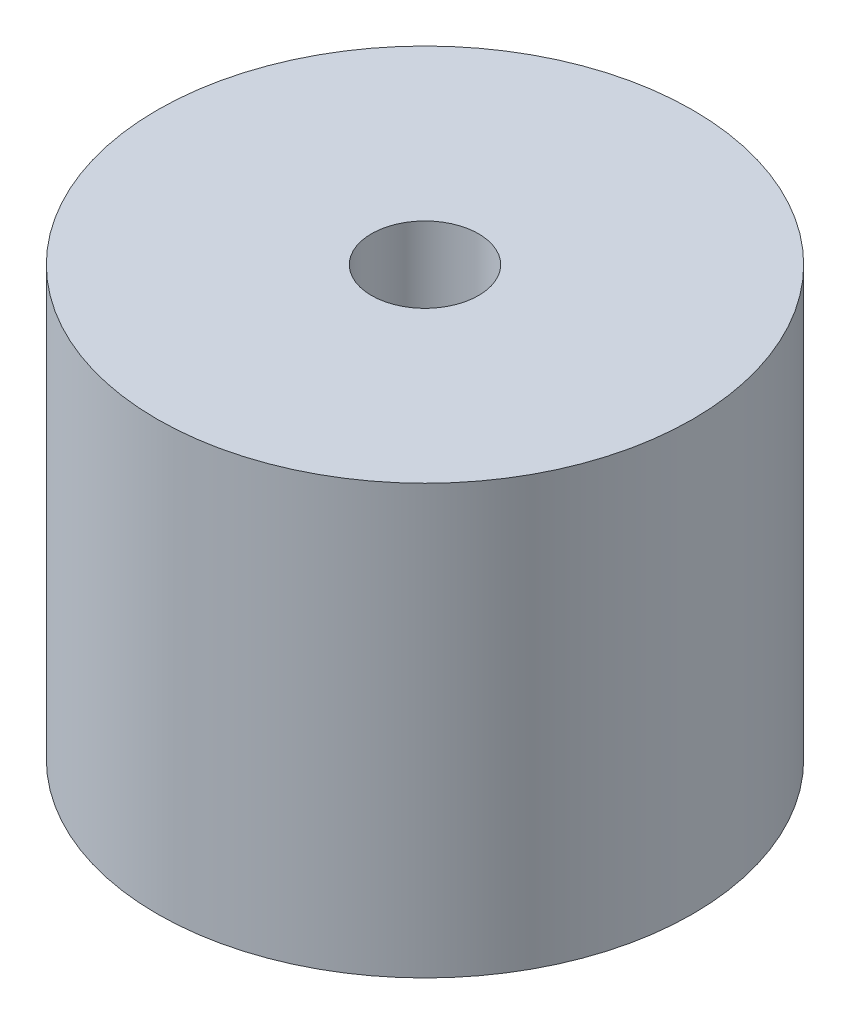
ISO-10303-21;
HEADER;
FILE_DESCRIPTION(('STEP AP214'),'2;1');
FILE_NAME('part.step','',(''),(''),'','','');
FILE_SCHEMA(('AUTOMOTIVE_DESIGN { 1 0 10303 214 1 1 1 1 }'));
ENDSEC;
DATA;
#1=APPLICATION_CONTEXT('core data for automotive mechanical design processes');
#2=APPLICATION_PROTOCOL_DEFINITION('international standard','automotive_design',2000,#1);
#3=PRODUCT_CONTEXT('',#1,'mechanical');
#4=PRODUCT('Part','Part','',(#3));
#5=PRODUCT_RELATED_PRODUCT_CATEGORY('part','',(#4));
#6=PRODUCT_DEFINITION_FORMATION('','',#4);
#7=PRODUCT_DEFINITION_CONTEXT('part definition',#1,'design');
#8=PRODUCT_DEFINITION('design','',#6,#7);
#9=PRODUCT_DEFINITION_SHAPE('','',#8);
#10=(LENGTH_UNIT() NAMED_UNIT(*) SI_UNIT(.MILLI.,.METRE.));
#11=(NAMED_UNIT(*) PLANE_ANGLE_UNIT() SI_UNIT($,.RADIAN.));
#12=(NAMED_UNIT(*) SI_UNIT($,.STERADIAN.) SOLID_ANGLE_UNIT());
#13=UNCERTAINTY_MEASURE_WITH_UNIT(LENGTH_MEASURE(1.E-05),#10,'distance_accuracy_value','');
#14=(GEOMETRIC_REPRESENTATION_CONTEXT(3) GLOBAL_UNCERTAINTY_ASSIGNED_CONTEXT((#13)) GLOBAL_UNIT_ASSIGNED_CONTEXT((#10,
#11,#12)) REPRESENTATION_CONTEXT('',''));
#15=CARTESIAN_POINT('',(0.,0.,0.));
#16=DIRECTION('',(0.,0.,1.));
#17=DIRECTION('',(1.,0.,0.));
#18=AXIS2_PLACEMENT_3D('',#15,#16,#17);
#19=CARTESIAN_POINT('',(-6.31474001961173,20.,-6.44629710335362));
#20=DIRECTION('',(0.,1.,0.));
#21=DIRECTION('',(0.,0.,1.));
#22=AXIS2_PLACEMENT_3D('',#19,#20,#21);
#23=PLANE('',#22);
#24=CARTESIAN_POINT('',(-6.31474001961173,20.,-6.44629710335362));
#25=DIRECTION('',(0.,1.,0.));
#26=DIRECTION('',(0.,0.,1.));
#27=AXIS2_PLACEMENT_3D('',#24,#25,#26);
#28=CIRCLE('',#27,12.5);
#29=CARTESIAN_POINT('',(-6.31474001961173,20.,6.05370289664638));
#30=VERTEX_POINT('',#29);
#31=EDGE_CURVE('E10',#30,#30,#28,.T.);
#32=ORIENTED_EDGE('',*,*,#31,.T.);
#33=EDGE_LOOP('',(#32));
#34=FACE_BOUND('',#33,.T.);
#35=CARTESIAN_POINT('',(-6.31474001961173,20.,-6.44629710335362));
#36=DIRECTION('',(0.,1.,0.));
#37=DIRECTION('',(0.,0.,1.));
#38=AXIS2_PLACEMENT_3D('',#35,#36,#37);
#39=CIRCLE('',#38,2.5);
#40=CARTESIAN_POINT('',(-6.31474001961173,20.,-3.94629710335362));
#41=VERTEX_POINT('',#40);
#42=EDGE_CURVE('E42',#41,#41,#39,.T.);
#43=ORIENTED_EDGE('',*,*,#42,.F.);
#44=EDGE_LOOP('',(#43));
#45=FACE_BOUND('',#44,.T.);
#46=ADVANCED_FACE('F31',(#34,#45),#23,.T.);
#47=CARTESIAN_POINT('',(-6.31474001961173,0.,-6.44629710335362));
#48=DIRECTION('',(0.,1.,0.));
#49=DIRECTION('',(0.,0.,1.));
#50=AXIS2_PLACEMENT_3D('',#47,#48,#49);
#51=PLANE('',#50);
#52=CARTESIAN_POINT('',(-6.31474001961173,0.,-6.44629710335362));
#53=DIRECTION('',(0.,1.,0.));
#54=DIRECTION('',(0.,0.,1.));
#55=AXIS2_PLACEMENT_3D('',#52,#53,#54);
#56=CIRCLE('',#55,12.5);
#57=CARTESIAN_POINT('',(-6.31474001961173,0.,6.05370289664638));
#58=VERTEX_POINT('',#57);
#59=EDGE_CURVE('E35',#58,#58,#56,.T.);
#60=ORIENTED_EDGE('',*,*,#59,.F.);
#61=EDGE_LOOP('',(#60));
#62=FACE_BOUND('',#61,.T.);
#63=CARTESIAN_POINT('',(-6.31474001961173,0.,-6.44629710335362));
#64=DIRECTION('',(0.,1.,0.));
#65=DIRECTION('',(0.,0.,1.));
#66=AXIS2_PLACEMENT_3D('',#63,#64,#65);
#67=CIRCLE('',#66,2.5);
#68=CARTESIAN_POINT('',(-6.31474001961173,0.,-3.94629710335362));
#69=VERTEX_POINT('',#68);
#70=EDGE_CURVE('E44',#69,#69,#67,.T.);
#71=ORIENTED_EDGE('',*,*,#70,.T.);
#72=EDGE_LOOP('',(#71));
#73=FACE_BOUND('',#72,.T.);
#74=ADVANCED_FACE('F54',(#62,#73),#51,.F.);
#75=CARTESIAN_POINT('',(-6.31474001961173,20.,-6.44629710335362));
#76=DIRECTION('',(0.,-1.,0.));
#77=DIRECTION('',(0.,0.,-1.));
#78=AXIS2_PLACEMENT_3D('',#75,#76,#77);
#79=CYLINDRICAL_SURFACE('',#78,12.5);
#80=ORIENTED_EDGE('',*,*,#31,.F.);
#81=EDGE_LOOP('',(#80));
#82=FACE_BOUND('',#81,.T.);
#83=ORIENTED_EDGE('',*,*,#59,.T.);
#84=EDGE_LOOP('',(#83));
#85=FACE_BOUND('',#84,.T.);
#86=ADVANCED_FACE('F33',(#82,#85),#79,.T.);
#87=CARTESIAN_POINT('',(-6.31474001961173,20.,-6.44629710335362));
#88=DIRECTION('',(0.,-1.,0.));
#89=DIRECTION('',(0.,0.,-1.));
#90=AXIS2_PLACEMENT_3D('',#87,#88,#89);
#91=CYLINDRICAL_SURFACE('',#90,2.5);
#92=ORIENTED_EDGE('',*,*,#42,.T.);
#93=EDGE_LOOP('',(#92));
#94=FACE_BOUND('',#93,.T.);
#95=ORIENTED_EDGE('',*,*,#70,.F.);
#96=EDGE_LOOP('',(#95));
#97=FACE_BOUND('',#96,.T.);
#98=ADVANCED_FACE('F50',(#94,#97),#91,.F.);
#99=CLOSED_SHELL('',(#46,#74,#86,#98));
#100=MANIFOLD_SOLID_BREP('B2',#99);
#101=ADVANCED_BREP_SHAPE_REPRESENTATION('',(#18,#100),#14);
#102=SHAPE_DEFINITION_REPRESENTATION(#9,#101);
ENDSEC;
END-ISO-10303-21;
